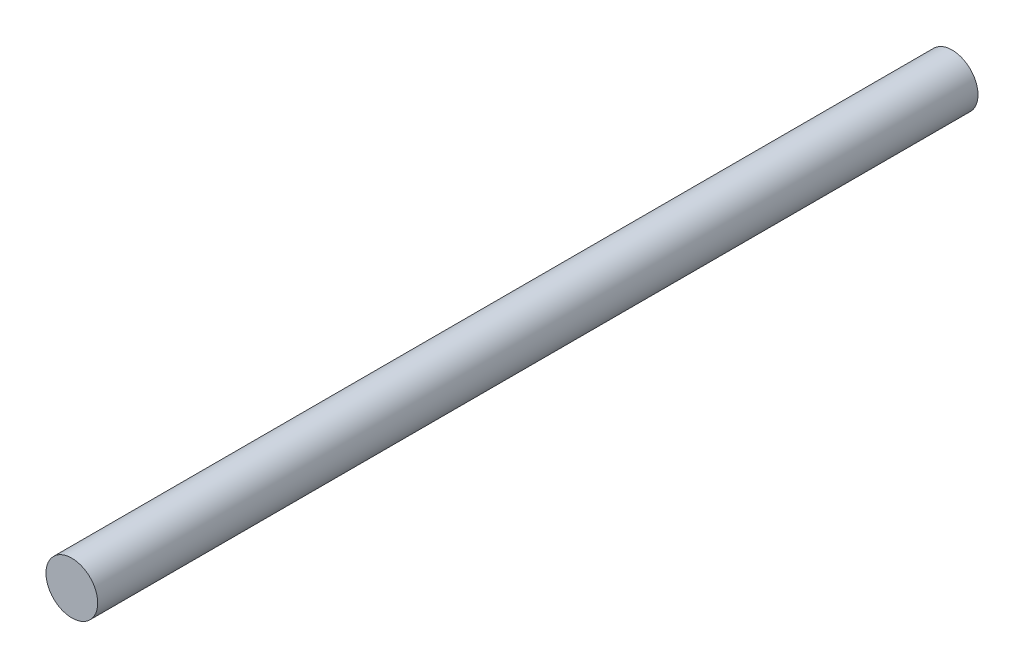
ISO-10303-21;
HEADER;
FILE_DESCRIPTION(('STEP AP214'),'2;1');
FILE_NAME('part.step','',(''),(''),'','','');
FILE_SCHEMA(('AUTOMOTIVE_DESIGN { 1 0 10303 214 1 1 1 1 }'));
ENDSEC;
DATA;
#1=APPLICATION_CONTEXT('core data for automotive mechanical design processes');
#2=APPLICATION_PROTOCOL_DEFINITION('international standard','automotive_design',2000,#1);
#3=PRODUCT_CONTEXT('',#1,'mechanical');
#4=PRODUCT('Part','Part','',(#3));
#5=PRODUCT_RELATED_PRODUCT_CATEGORY('part','',(#4));
#6=PRODUCT_DEFINITION_FORMATION('','',#4);
#7=PRODUCT_DEFINITION_CONTEXT('part definition',#1,'design');
#8=PRODUCT_DEFINITION('design','',#6,#7);
#9=PRODUCT_DEFINITION_SHAPE('','',#8);
#10=(LENGTH_UNIT() NAMED_UNIT(*) SI_UNIT(.MILLI.,.METRE.));
#11=(NAMED_UNIT(*) PLANE_ANGLE_UNIT() SI_UNIT($,.RADIAN.));
#12=(NAMED_UNIT(*) SI_UNIT($,.STERADIAN.) SOLID_ANGLE_UNIT());
#13=UNCERTAINTY_MEASURE_WITH_UNIT(LENGTH_MEASURE(1.E-05),#10,'distance_accuracy_value','');
#14=(GEOMETRIC_REPRESENTATION_CONTEXT(3) GLOBAL_UNCERTAINTY_ASSIGNED_CONTEXT((#13)) GLOBAL_UNIT_ASSIGNED_CONTEXT((#10,
#11,#12)) REPRESENTATION_CONTEXT('',''));
#15=CARTESIAN_POINT('',(0.,0.,0.));
#16=DIRECTION('',(0.,0.,1.));
#17=DIRECTION('',(1.,0.,0.));
#18=AXIS2_PLACEMENT_3D('',#15,#16,#17);
#19=CARTESIAN_POINT('',(0.,0.,340.));
#20=DIRECTION('',(0.,0.,-1.));
#21=DIRECTION('',(-1.,0.,0.));
#22=AXIS2_PLACEMENT_3D('',#19,#20,#21);
#23=CYLINDRICAL_SURFACE('',#22,10.);
#24=CARTESIAN_POINT('',(0.,0.,340.));
#25=DIRECTION('',(0.,0.,1.));
#26=DIRECTION('',(1.,0.,0.));
#27=AXIS2_PLACEMENT_3D('',#24,#25,#26);
#28=CIRCLE('',#27,10.);
#29=CARTESIAN_POINT('',(10.,0.,340.));
#30=VERTEX_POINT('',#29);
#31=EDGE_CURVE('E10',#30,#30,#28,.T.);
#32=ORIENTED_EDGE('',*,*,#31,.F.);
#33=EDGE_LOOP('',(#32));
#34=FACE_BOUND('',#33,.T.);
#35=CARTESIAN_POINT('',(0.,0.,0.));
#36=DIRECTION('',(0.,0.,1.));
#37=DIRECTION('',(1.,0.,0.));
#38=AXIS2_PLACEMENT_3D('',#35,#36,#37);
#39=CIRCLE('',#38,10.);
#40=CARTESIAN_POINT('',(10.,0.,0.));
#41=VERTEX_POINT('',#40);
#42=EDGE_CURVE('E38',#41,#41,#39,.T.);
#43=ORIENTED_EDGE('',*,*,#42,.T.);
#44=EDGE_LOOP('',(#43));
#45=FACE_BOUND('',#44,.T.);
#46=ADVANCED_FACE('F35',(#34,#45),#23,.T.);
#47=CARTESIAN_POINT('',(0.,0.,340.));
#48=DIRECTION('',(0.,0.,1.));
#49=DIRECTION('',(1.,0.,0.));
#50=AXIS2_PLACEMENT_3D('',#47,#48,#49);
#51=PLANE('',#50);
#52=ORIENTED_EDGE('',*,*,#31,.T.);
#53=EDGE_LOOP('',(#52));
#54=FACE_BOUND('',#53,.T.);
#55=ADVANCED_FACE('F50',(#54),#51,.T.);
#56=CARTESIAN_POINT('',(0.,0.,0.));
#57=DIRECTION('',(0.,0.,1.));
#58=DIRECTION('',(1.,0.,0.));
#59=AXIS2_PLACEMENT_3D('',#56,#57,#58);
#60=PLANE('',#59);
#61=ORIENTED_EDGE('',*,*,#42,.F.);
#62=EDGE_LOOP('',(#61));
#63=FACE_BOUND('',#62,.T.);
#64=ADVANCED_FACE('F48',(#63),#60,.F.);
#65=CLOSED_SHELL('',(#46,#55,#64));
#66=MANIFOLD_SOLID_BREP('B2',#65);
#67=ADVANCED_BREP_SHAPE_REPRESENTATION('',(#18,#66),#14);
#68=SHAPE_DEFINITION_REPRESENTATION(#9,#67);
ENDSEC;
END-ISO-10303-21;
